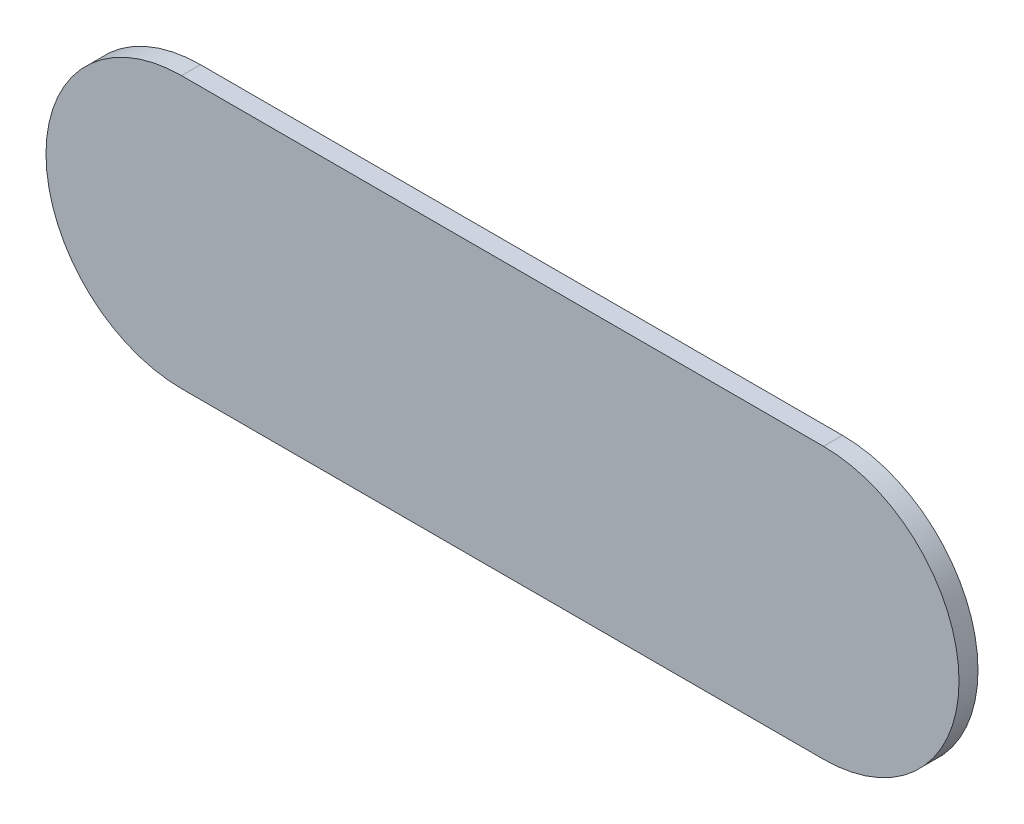
ISO-10303-21;
HEADER;
FILE_DESCRIPTION(('STEP AP214'),'2;1');
FILE_NAME('part.step','',(''),(''),'','','');
FILE_SCHEMA(('AUTOMOTIVE_DESIGN { 1 0 10303 214 1 1 1 1 }'));
ENDSEC;
DATA;
#1=APPLICATION_CONTEXT('core data for automotive mechanical design processes');
#2=APPLICATION_PROTOCOL_DEFINITION('international standard','automotive_design',2000,#1);
#3=PRODUCT_CONTEXT('',#1,'mechanical');
#4=PRODUCT('Part','Part','',(#3));
#5=PRODUCT_RELATED_PRODUCT_CATEGORY('part','',(#4));
#6=PRODUCT_DEFINITION_FORMATION('','',#4);
#7=PRODUCT_DEFINITION_CONTEXT('part definition',#1,'design');
#8=PRODUCT_DEFINITION('design','',#6,#7);
#9=PRODUCT_DEFINITION_SHAPE('','',#8);
#10=(LENGTH_UNIT() NAMED_UNIT(*) SI_UNIT(.MILLI.,.METRE.));
#11=(NAMED_UNIT(*) PLANE_ANGLE_UNIT() SI_UNIT($,.RADIAN.));
#12=(NAMED_UNIT(*) SI_UNIT($,.STERADIAN.) SOLID_ANGLE_UNIT());
#13=UNCERTAINTY_MEASURE_WITH_UNIT(LENGTH_MEASURE(1.E-05),#10,'distance_accuracy_value','');
#14=(GEOMETRIC_REPRESENTATION_CONTEXT(3) GLOBAL_UNCERTAINTY_ASSIGNED_CONTEXT((#13)) GLOBAL_UNIT_ASSIGNED_CONTEXT((#10,
#11,#12)) REPRESENTATION_CONTEXT('',''));
#15=CARTESIAN_POINT('',(0.,0.,0.));
#16=DIRECTION('',(0.,0.,1.));
#17=DIRECTION('',(1.,0.,0.));
#18=AXIS2_PLACEMENT_3D('',#15,#16,#17);
#19=CARTESIAN_POINT('',(97.894,-97.744,1.635));
#20=DIRECTION('',(0.,0.,1.));
#21=DIRECTION('',(1.,0.,0.));
#22=AXIS2_PLACEMENT_3D('',#19,#20,#21);
#23=PLANE('',#22);
#24=DIRECTION('',(-1.,0.,0.));
#25=VECTOR('',#24,1.);
#26=CARTESIAN_POINT('',(97.894,-97.744,1.635));
#27=LINE('',#26,#25);
#28=CARTESIAN_POINT('',(97.894,-97.744,1.635));
#29=VERTEX_POINT('',#28);
#30=CARTESIAN_POINT('',(96.71,-97.744,1.635));
#31=VERTEX_POINT('',#30);
#32=EDGE_CURVE('E81',#29,#31,#27,.T.);
#33=ORIENTED_EDGE('',*,*,#32,.T.);
#34=CARTESIAN_POINT('',(96.71,-97.994,1.635));
#35=DIRECTION('',(0.,0.,1.));
#36=DIRECTION('',(0.,1.,0.));
#37=AXIS2_PLACEMENT_3D('',#34,#35,#36);
#38=CIRCLE('',#37,0.25);
#39=CARTESIAN_POINT('',(96.71,-98.244,1.635));
#40=VERTEX_POINT('',#39);
#41=EDGE_CURVE('E107',#31,#40,#38,.T.);
#42=ORIENTED_EDGE('',*,*,#41,.T.);
#43=DIRECTION('',(1.,0.,0.));
#44=VECTOR('',#43,1.);
#45=CARTESIAN_POINT('',(96.71,-98.244,1.635));
#46=LINE('',#45,#44);
#47=CARTESIAN_POINT('',(97.894,-98.244,1.635));
#48=VERTEX_POINT('',#47);
#49=EDGE_CURVE('E74',#40,#48,#46,.T.);
#50=ORIENTED_EDGE('',*,*,#49,.T.);
#51=CARTESIAN_POINT('',(97.894,-97.994,1.635));
#52=DIRECTION('',(0.,0.,1.));
#53=DIRECTION('',(0.,-1.,0.));
#54=AXIS2_PLACEMENT_3D('',#51,#52,#53);
#55=CIRCLE('',#54,0.25);
#56=EDGE_CURVE('E11',#48,#29,#55,.T.);
#57=ORIENTED_EDGE('',*,*,#56,.T.);
#58=EDGE_LOOP('',(#33,#42,#50,#57));
#59=FACE_BOUND('',#58,.T.);
#60=ADVANCED_FACE('F17',(#59),#23,.T.);
#61=CARTESIAN_POINT('',(97.894,-97.744,1.6));
#62=DIRECTION('',(0.,0.,1.));
#63=DIRECTION('',(1.,0.,0.));
#64=AXIS2_PLACEMENT_3D('',#61,#62,#63);
#65=PLANE('',#64);
#66=CARTESIAN_POINT('',(97.894,-97.994,1.6));
#67=DIRECTION('',(0.,0.,1.));
#68=DIRECTION('',(0.,-1.,0.));
#69=AXIS2_PLACEMENT_3D('',#66,#67,#68);
#70=CIRCLE('',#69,0.25);
#71=CARTESIAN_POINT('',(97.894,-98.244,1.6));
#72=VERTEX_POINT('',#71);
#73=CARTESIAN_POINT('',(97.894,-97.744,1.6));
#74=VERTEX_POINT('',#73);
#75=EDGE_CURVE('E25',#72,#74,#70,.T.);
#76=ORIENTED_EDGE('',*,*,#75,.F.);
#77=DIRECTION('',(1.,0.,0.));
#78=VECTOR('',#77,1.);
#79=CARTESIAN_POINT('',(96.71,-98.244,1.6));
#80=LINE('',#79,#78);
#81=CARTESIAN_POINT('',(96.71,-98.244,1.6));
#82=VERTEX_POINT('',#81);
#83=EDGE_CURVE('E110',#82,#72,#80,.T.);
#84=ORIENTED_EDGE('',*,*,#83,.F.);
#85=CARTESIAN_POINT('',(96.71,-97.994,1.6));
#86=DIRECTION('',(0.,0.,1.));
#87=DIRECTION('',(0.,1.,0.));
#88=AXIS2_PLACEMENT_3D('',#85,#86,#87);
#89=CIRCLE('',#88,0.25);
#90=CARTESIAN_POINT('',(96.71,-97.744,1.6));
#91=VERTEX_POINT('',#90);
#92=EDGE_CURVE('E83',#91,#82,#89,.T.);
#93=ORIENTED_EDGE('',*,*,#92,.F.);
#94=DIRECTION('',(-1.,0.,0.));
#95=VECTOR('',#94,1.);
#96=CARTESIAN_POINT('',(97.894,-97.744,1.6));
#97=LINE('',#96,#95);
#98=EDGE_CURVE('E79',#74,#91,#97,.T.);
#99=ORIENTED_EDGE('',*,*,#98,.F.);
#100=EDGE_LOOP('',(#76,#84,#93,#99));
#101=FACE_BOUND('',#100,.T.);
#102=ADVANCED_FACE('F85',(#101),#65,.F.);
#103=CARTESIAN_POINT('',(97.894,-97.994,1.6));
#104=DIRECTION('',(0.,0.,-1.));
#105=DIRECTION('',(0.,-1.,0.));
#106=AXIS2_PLACEMENT_3D('',#103,#104,#105);
#107=CYLINDRICAL_SURFACE('',#106,0.25);
#108=ORIENTED_EDGE('',*,*,#75,.T.);
#109=DIRECTION('',(0.,0.,1.));
#110=VECTOR('',#109,1.);
#111=CARTESIAN_POINT('',(97.894,-97.744,1.6));
#112=LINE('',#111,#110);
#113=EDGE_CURVE('E68',#74,#29,#112,.T.);
#114=ORIENTED_EDGE('',*,*,#113,.T.);
#115=ORIENTED_EDGE('',*,*,#56,.F.);
#116=DIRECTION('',(0.,0.,1.));
#117=VECTOR('',#116,1.);
#118=CARTESIAN_POINT('',(97.894,-98.244,1.6));
#119=LINE('',#118,#117);
#120=EDGE_CURVE('E71',#72,#48,#119,.T.);
#121=ORIENTED_EDGE('',*,*,#120,.F.);
#122=EDGE_LOOP('',(#108,#114,#115,#121));
#123=FACE_BOUND('',#122,.T.);
#124=ADVANCED_FACE('F67',(#123),#107,.T.);
#125=CARTESIAN_POINT('',(96.71,-98.244,1.6));
#126=DIRECTION('',(0.,1.,0.));
#127=DIRECTION('',(1.,0.,0.));
#128=AXIS2_PLACEMENT_3D('',#125,#126,#127);
#129=PLANE('',#128);
#130=ORIENTED_EDGE('',*,*,#83,.T.);
#131=ORIENTED_EDGE('',*,*,#120,.T.);
#132=ORIENTED_EDGE('',*,*,#49,.F.);
#133=DIRECTION('',(0.,0.,1.));
#134=VECTOR('',#133,1.);
#135=CARTESIAN_POINT('',(96.71,-98.244,1.6));
#136=LINE('',#135,#134);
#137=EDGE_CURVE('E103',#82,#40,#136,.T.);
#138=ORIENTED_EDGE('',*,*,#137,.F.);
#139=EDGE_LOOP('',(#130,#131,#132,#138));
#140=FACE_BOUND('',#139,.T.);
#141=ADVANCED_FACE('F119',(#140),#129,.F.);
#142=CARTESIAN_POINT('',(96.71,-97.994,1.6));
#143=DIRECTION('',(0.,0.,-1.));
#144=DIRECTION('',(0.,1.,0.));
#145=AXIS2_PLACEMENT_3D('',#142,#143,#144);
#146=CYLINDRICAL_SURFACE('',#145,0.25);
#147=ORIENTED_EDGE('',*,*,#92,.T.);
#148=ORIENTED_EDGE('',*,*,#137,.T.);
#149=ORIENTED_EDGE('',*,*,#41,.F.);
#150=DIRECTION('',(0.,0.,1.));
#151=VECTOR('',#150,1.);
#152=CARTESIAN_POINT('',(96.71,-97.744,1.6));
#153=LINE('',#152,#151);
#154=EDGE_CURVE('E89',#91,#31,#153,.T.);
#155=ORIENTED_EDGE('',*,*,#154,.F.);
#156=EDGE_LOOP('',(#147,#148,#149,#155));
#157=FACE_BOUND('',#156,.T.);
#158=ADVANCED_FACE('F121',(#157),#146,.T.);
#159=CARTESIAN_POINT('',(97.894,-97.744,1.6));
#160=DIRECTION('',(0.,-1.,0.));
#161=DIRECTION('',(0.,0.,-1.));
#162=AXIS2_PLACEMENT_3D('',#159,#160,#161);
#163=PLANE('',#162);
#164=ORIENTED_EDGE('',*,*,#98,.T.);
#165=ORIENTED_EDGE('',*,*,#154,.T.);
#166=ORIENTED_EDGE('',*,*,#32,.F.);
#167=ORIENTED_EDGE('',*,*,#113,.F.);
#168=EDGE_LOOP('',(#164,#165,#166,#167));
#169=FACE_BOUND('',#168,.T.);
#170=ADVANCED_FACE('F77',(#169),#163,.F.);
#171=CLOSED_SHELL('',(#60,#102,#124,#141,#158,#170));
#172=MANIFOLD_SOLID_BREP('B1',#171);
#173=ADVANCED_BREP_SHAPE_REPRESENTATION('',(#18,#172),#14);
#174=SHAPE_DEFINITION_REPRESENTATION(#9,#173);
ENDSEC;
END-ISO-10303-21;
